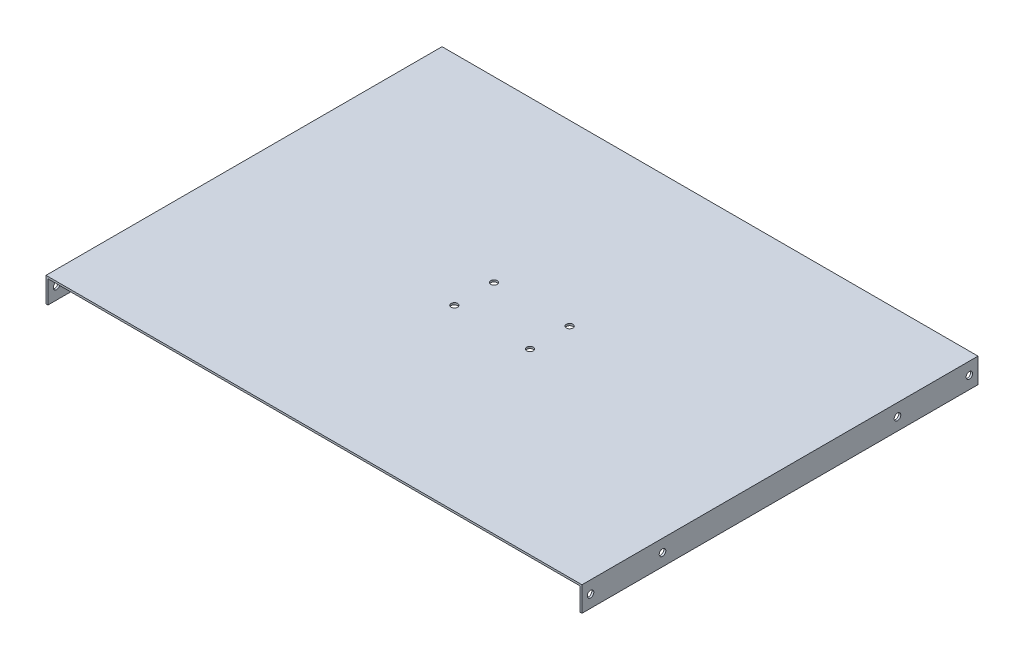
ISO-10303-21;
HEADER;
FILE_DESCRIPTION(('STEP AP214'),'2;1');
FILE_NAME('part.step','',(''),(''),'','','');
FILE_SCHEMA(('AUTOMOTIVE_DESIGN { 1 0 10303 214 1 1 1 1 }'));
ENDSEC;
DATA;
#1=APPLICATION_CONTEXT('core data for automotive mechanical design processes');
#2=APPLICATION_PROTOCOL_DEFINITION('international standard','automotive_design',2000,#1);
#3=PRODUCT_CONTEXT('',#1,'mechanical');
#4=PRODUCT('Part','Part','',(#3));
#5=PRODUCT_RELATED_PRODUCT_CATEGORY('part','',(#4));
#6=PRODUCT_DEFINITION_FORMATION('','',#4);
#7=PRODUCT_DEFINITION_CONTEXT('part definition',#1,'design');
#8=PRODUCT_DEFINITION('design','',#6,#7);
#9=PRODUCT_DEFINITION_SHAPE('','',#8);
#10=(LENGTH_UNIT() NAMED_UNIT(*) SI_UNIT(.MILLI.,.METRE.));
#11=(NAMED_UNIT(*) PLANE_ANGLE_UNIT() SI_UNIT($,.RADIAN.));
#12=(NAMED_UNIT(*) SI_UNIT($,.STERADIAN.) SOLID_ANGLE_UNIT());
#13=UNCERTAINTY_MEASURE_WITH_UNIT(LENGTH_MEASURE(1.E-05),#10,'distance_accuracy_value','');
#14=(GEOMETRIC_REPRESENTATION_CONTEXT(3) GLOBAL_UNCERTAINTY_ASSIGNED_CONTEXT((#13)) GLOBAL_UNIT_ASSIGNED_CONTEXT((#10,
#11,#12)) REPRESENTATION_CONTEXT('',''));
#15=CARTESIAN_POINT('',(0.,0.,0.));
#16=DIRECTION('',(0.,0.,1.));
#17=DIRECTION('',(1.,0.,0.));
#18=AXIS2_PLACEMENT_3D('',#15,#16,#17);
#19=CARTESIAN_POINT('',(0.,15.,0.));
#20=DIRECTION('',(0.,-1.,0.));
#21=DIRECTION('',(0.,0.,-1.));
#22=AXIS2_PLACEMENT_3D('',#19,#20,#21);
#23=PLANE('',#22);
#24=CARTESIAN_POINT('',(22.92,15.,12.));
#25=DIRECTION('',(0.,-1.,0.));
#26=DIRECTION('',(0.,0.,-1.));
#27=AXIS2_PLACEMENT_3D('',#24,#25,#26);
#28=CIRCLE('',#27,2.);
#29=CARTESIAN_POINT('',(22.92,15.,10.));
#30=VERTEX_POINT('',#29);
#31=EDGE_CURVE('E196',#30,#30,#28,.T.);
#32=ORIENTED_EDGE('',*,*,#31,.T.);
#33=EDGE_LOOP('',(#32));
#34=FACE_BOUND('',#33,.T.);
#35=CARTESIAN_POINT('',(-22.92,15.,-12.));
#36=DIRECTION('',(0.,-1.,0.));
#37=DIRECTION('',(0.,0.,-1.));
#38=AXIS2_PLACEMENT_3D('',#35,#36,#37);
#39=CIRCLE('',#38,2.);
#40=CARTESIAN_POINT('',(-22.92,15.,-14.));
#41=VERTEX_POINT('',#40);
#42=EDGE_CURVE('E185',#41,#41,#39,.T.);
#43=ORIENTED_EDGE('',*,*,#42,.T.);
#44=EDGE_LOOP('',(#43));
#45=FACE_BOUND('',#44,.T.);
#46=DIRECTION('',(0.,0.,-1.));
#47=VECTOR('',#46,1.);
#48=CARTESIAN_POINT('',(162.4,15.,120.));
#49=LINE('',#48,#47);
#50=CARTESIAN_POINT('',(162.4,15.,120.));
#51=VERTEX_POINT('',#50);
#52=CARTESIAN_POINT('',(162.4,15.,-120.));
#53=VERTEX_POINT('',#52);
#54=EDGE_CURVE('E152',#51,#53,#49,.T.);
#55=ORIENTED_EDGE('',*,*,#54,.T.);
#56=DIRECTION('',(-1.,0.,0.));
#57=VECTOR('',#56,1.);
#58=CARTESIAN_POINT('',(-162.4,15.,-120.));
#59=LINE('',#58,#57);
#60=CARTESIAN_POINT('',(-162.4,15.,-120.));
#61=VERTEX_POINT('',#60);
#62=EDGE_CURVE('E94',#53,#61,#59,.T.);
#63=ORIENTED_EDGE('',*,*,#62,.T.);
#64=DIRECTION('',(0.,0.,1.));
#65=VECTOR('',#64,1.);
#66=CARTESIAN_POINT('',(-162.4,15.,120.));
#67=LINE('',#66,#65);
#68=CARTESIAN_POINT('',(-162.4,15.,120.));
#69=VERTEX_POINT('',#68);
#70=EDGE_CURVE('E158',#61,#69,#67,.T.);
#71=ORIENTED_EDGE('',*,*,#70,.T.);
#72=DIRECTION('',(1.,0.,0.));
#73=VECTOR('',#72,1.);
#74=CARTESIAN_POINT('',(-162.4,15.,120.));
#75=LINE('',#74,#73);
#76=EDGE_CURVE('E66',#69,#51,#75,.T.);
#77=ORIENTED_EDGE('',*,*,#76,.T.);
#78=EDGE_LOOP('',(#55,#63,#71,#77));
#79=FACE_BOUND('',#78,.T.);
#80=CARTESIAN_POINT('',(22.92,15.,-12.));
#81=DIRECTION('',(0.,-1.,0.));
#82=DIRECTION('',(0.,0.,-1.));
#83=AXIS2_PLACEMENT_3D('',#80,#81,#82);
#84=CIRCLE('',#83,2.);
#85=CARTESIAN_POINT('',(22.92,15.,-14.));
#86=VERTEX_POINT('',#85);
#87=EDGE_CURVE('E191',#86,#86,#84,.F.);
#88=ORIENTED_EDGE('',*,*,#87,.F.);
#89=EDGE_LOOP('',(#88));
#90=FACE_BOUND('',#89,.T.);
#91=CARTESIAN_POINT('',(-22.92,15.,12.));
#92=DIRECTION('',(0.,-1.,0.));
#93=DIRECTION('',(0.,0.,-1.));
#94=AXIS2_PLACEMENT_3D('',#91,#92,#93);
#95=CIRCLE('',#94,2.);
#96=CARTESIAN_POINT('',(-22.92,15.,10.));
#97=VERTEX_POINT('',#96);
#98=EDGE_CURVE('E201',#97,#97,#95,.F.);
#99=ORIENTED_EDGE('',*,*,#98,.F.);
#100=EDGE_LOOP('',(#99));
#101=FACE_BOUND('',#100,.T.);
#102=ADVANCED_FACE('F39',(#34,#45,#79,#90,#101),#23,.F.);
#103=CARTESIAN_POINT('',(0.,13.8,0.));
#104=DIRECTION('',(0.,-1.,0.));
#105=DIRECTION('',(0.,0.,-1.));
#106=AXIS2_PLACEMENT_3D('',#103,#104,#105);
#107=PLANE('',#106);
#108=CARTESIAN_POINT('',(22.92,13.8,-12.));
#109=DIRECTION('',(0.,-1.,0.));
#110=DIRECTION('',(0.,0.,-1.));
#111=AXIS2_PLACEMENT_3D('',#108,#109,#110);
#112=CIRCLE('',#111,2.);
#113=CARTESIAN_POINT('',(22.92,13.8,-14.));
#114=VERTEX_POINT('',#113);
#115=EDGE_CURVE('E187',#114,#114,#112,.F.);
#116=ORIENTED_EDGE('',*,*,#115,.T.);
#117=EDGE_LOOP('',(#116));
#118=FACE_BOUND('',#117,.T.);
#119=CARTESIAN_POINT('',(-22.92,13.8,-12.));
#120=DIRECTION('',(0.,-1.,0.));
#121=DIRECTION('',(0.,0.,-1.));
#122=AXIS2_PLACEMENT_3D('',#119,#120,#121);
#123=CIRCLE('',#122,2.);
#124=CARTESIAN_POINT('',(-22.92,13.8,-14.));
#125=VERTEX_POINT('',#124);
#126=EDGE_CURVE('E181',#125,#125,#123,.T.);
#127=ORIENTED_EDGE('',*,*,#126,.F.);
#128=EDGE_LOOP('',(#127));
#129=FACE_BOUND('',#128,.T.);
#130=DIRECTION('',(0.,0.,-1.));
#131=VECTOR('',#130,1.);
#132=CARTESIAN_POINT('',(161.2,13.8,120.));
#133=LINE('',#132,#131);
#134=CARTESIAN_POINT('',(161.2,13.8,120.));
#135=VERTEX_POINT('',#134);
#136=CARTESIAN_POINT('',(161.2,13.8,-120.));
#137=VERTEX_POINT('',#136);
#138=EDGE_CURVE('E122',#135,#137,#133,.T.);
#139=ORIENTED_EDGE('',*,*,#138,.F.);
#140=DIRECTION('',(1.,0.,0.));
#141=VECTOR('',#140,1.);
#142=CARTESIAN_POINT('',(-161.2,13.8,120.));
#143=LINE('',#142,#141);
#144=CARTESIAN_POINT('',(-161.2,13.8,120.));
#145=VERTEX_POINT('',#144);
#146=EDGE_CURVE('E267',#145,#135,#143,.T.);
#147=ORIENTED_EDGE('',*,*,#146,.F.);
#148=DIRECTION('',(0.,0.,1.));
#149=VECTOR('',#148,1.);
#150=CARTESIAN_POINT('',(-161.2,13.8,120.));
#151=LINE('',#150,#149);
#152=CARTESIAN_POINT('',(-161.2,13.8,-120.));
#153=VERTEX_POINT('',#152);
#154=EDGE_CURVE('E124',#153,#145,#151,.T.);
#155=ORIENTED_EDGE('',*,*,#154,.F.);
#156=DIRECTION('',(-1.,0.,0.));
#157=VECTOR('',#156,1.);
#158=CARTESIAN_POINT('',(-161.2,13.8,-120.));
#159=LINE('',#158,#157);
#160=EDGE_CURVE('E117',#137,#153,#159,.T.);
#161=ORIENTED_EDGE('',*,*,#160,.F.);
#162=EDGE_LOOP('',(#139,#147,#155,#161));
#163=FACE_BOUND('',#162,.T.);
#164=CARTESIAN_POINT('',(22.92,13.8,12.));
#165=DIRECTION('',(0.,-1.,0.));
#166=DIRECTION('',(0.,0.,-1.));
#167=AXIS2_PLACEMENT_3D('',#164,#165,#166);
#168=CIRCLE('',#167,2.);
#169=CARTESIAN_POINT('',(22.92,13.8,10.));
#170=VERTEX_POINT('',#169);
#171=EDGE_CURVE('E192',#170,#170,#168,.T.);
#172=ORIENTED_EDGE('',*,*,#171,.F.);
#173=EDGE_LOOP('',(#172));
#174=FACE_BOUND('',#173,.T.);
#175=CARTESIAN_POINT('',(-22.92,13.8,12.));
#176=DIRECTION('',(0.,-1.,0.));
#177=DIRECTION('',(0.,0.,-1.));
#178=AXIS2_PLACEMENT_3D('',#175,#176,#177);
#179=CIRCLE('',#178,2.);
#180=CARTESIAN_POINT('',(-22.92,13.8,10.));
#181=VERTEX_POINT('',#180);
#182=EDGE_CURVE('E197',#181,#181,#179,.F.);
#183=ORIENTED_EDGE('',*,*,#182,.T.);
#184=EDGE_LOOP('',(#183));
#185=FACE_BOUND('',#184,.T.);
#186=ADVANCED_FACE('F119',(#118,#129,#163,#174,#185),#107,.T.);
#187=CARTESIAN_POINT('',(-162.4,15.,-120.));
#188=DIRECTION('',(0.,0.,1.));
#189=DIRECTION('',(1.,0.,0.));
#190=AXIS2_PLACEMENT_3D('',#187,#188,#189);
#191=PLANE('',#190);
#192=DIRECTION('',(0.,-1.,0.));
#193=VECTOR('',#192,1.);
#194=CARTESIAN_POINT('',(161.2,13.8,-120.));
#195=LINE('',#194,#193);
#196=CARTESIAN_POINT('',(161.2,0.,-120.));
#197=VERTEX_POINT('',#196);
#198=EDGE_CURVE('E131',#137,#197,#195,.T.);
#199=ORIENTED_EDGE('',*,*,#198,.F.);
#200=ORIENTED_EDGE('',*,*,#160,.T.);
#201=DIRECTION('',(0.,-1.,0.));
#202=VECTOR('',#201,1.);
#203=CARTESIAN_POINT('',(-161.2,13.8,-120.));
#204=LINE('',#203,#202);
#205=CARTESIAN_POINT('',(-161.2,0.,-120.));
#206=VERTEX_POINT('',#205);
#207=EDGE_CURVE('E142',#153,#206,#204,.T.);
#208=ORIENTED_EDGE('',*,*,#207,.T.);
#209=DIRECTION('',(-1.,0.,0.));
#210=VECTOR('',#209,1.);
#211=CARTESIAN_POINT('',(-162.4,0.,-120.));
#212=LINE('',#211,#210);
#213=CARTESIAN_POINT('',(-162.4,0.,-120.));
#214=VERTEX_POINT('',#213);
#215=EDGE_CURVE('E147',#206,#214,#212,.T.);
#216=ORIENTED_EDGE('',*,*,#215,.T.);
#217=DIRECTION('',(0.,-1.,0.));
#218=VECTOR('',#217,1.);
#219=CARTESIAN_POINT('',(-162.4,15.,-120.));
#220=LINE('',#219,#218);
#221=EDGE_CURVE('E49',#61,#214,#220,.T.);
#222=ORIENTED_EDGE('',*,*,#221,.F.);
#223=ORIENTED_EDGE('',*,*,#62,.F.);
#224=DIRECTION('',(0.,-1.,0.));
#225=VECTOR('',#224,1.);
#226=CARTESIAN_POINT('',(162.4,15.,-120.));
#227=LINE('',#226,#225);
#228=CARTESIAN_POINT('',(162.4,0.,-120.));
#229=VERTEX_POINT('',#228);
#230=EDGE_CURVE('E11',#53,#229,#227,.T.);
#231=ORIENTED_EDGE('',*,*,#230,.T.);
#232=EDGE_CURVE('E139',#229,#197,#212,.T.);
#233=ORIENTED_EDGE('',*,*,#232,.T.);
#234=EDGE_LOOP('',(#199,#200,#208,#216,#222,#223,#231,#233));
#235=FACE_BOUND('',#234,.T.);
#236=ADVANCED_FACE('F138',(#235),#191,.F.);
#237=CARTESIAN_POINT('',(-162.4,15.,120.));
#238=DIRECTION('',(0.,0.,-1.));
#239=DIRECTION('',(-1.,0.,0.));
#240=AXIS2_PLACEMENT_3D('',#237,#238,#239);
#241=PLANE('',#240);
#242=DIRECTION('',(0.,-1.,0.));
#243=VECTOR('',#242,1.);
#244=CARTESIAN_POINT('',(161.2,13.8,120.));
#245=LINE('',#244,#243);
#246=CARTESIAN_POINT('',(161.2,0.,120.));
#247=VERTEX_POINT('',#246);
#248=EDGE_CURVE('E133',#135,#247,#245,.T.);
#249=ORIENTED_EDGE('',*,*,#248,.T.);
#250=DIRECTION('',(1.,0.,0.));
#251=VECTOR('',#250,1.);
#252=CARTESIAN_POINT('',(-162.4,0.,120.));
#253=LINE('',#252,#251);
#254=CARTESIAN_POINT('',(162.4,0.,120.));
#255=VERTEX_POINT('',#254);
#256=EDGE_CURVE('E87',#247,#255,#253,.T.);
#257=ORIENTED_EDGE('',*,*,#256,.T.);
#258=DIRECTION('',(0.,-1.,0.));
#259=VECTOR('',#258,1.);
#260=CARTESIAN_POINT('',(162.4,15.,120.));
#261=LINE('',#260,#259);
#262=EDGE_CURVE('E162',#51,#255,#261,.T.);
#263=ORIENTED_EDGE('',*,*,#262,.F.);
#264=ORIENTED_EDGE('',*,*,#76,.F.);
#265=DIRECTION('',(0.,-1.,0.));
#266=VECTOR('',#265,1.);
#267=CARTESIAN_POINT('',(-162.4,15.,120.));
#268=LINE('',#267,#266);
#269=CARTESIAN_POINT('',(-162.4,0.,120.));
#270=VERTEX_POINT('',#269);
#271=EDGE_CURVE('E174',#69,#270,#268,.T.);
#272=ORIENTED_EDGE('',*,*,#271,.T.);
#273=CARTESIAN_POINT('',(-161.2,0.,120.));
#274=VERTEX_POINT('',#273);
#275=EDGE_CURVE('E155',#270,#274,#253,.T.);
#276=ORIENTED_EDGE('',*,*,#275,.T.);
#277=DIRECTION('',(0.,-1.,0.));
#278=VECTOR('',#277,1.);
#279=CARTESIAN_POINT('',(-161.2,13.8,120.));
#280=LINE('',#279,#278);
#281=EDGE_CURVE('E57',#145,#274,#280,.T.);
#282=ORIENTED_EDGE('',*,*,#281,.F.);
#283=ORIENTED_EDGE('',*,*,#146,.T.);
#284=EDGE_LOOP('',(#249,#257,#263,#264,#272,#276,#282,#283));
#285=FACE_BOUND('',#284,.T.);
#286=ADVANCED_FACE('F309',(#285),#241,.F.);
#287=CARTESIAN_POINT('',(0.,0.,0.));
#288=DIRECTION('',(0.,-1.,0.));
#289=DIRECTION('',(0.,0.,-1.));
#290=AXIS2_PLACEMENT_3D('',#287,#288,#289);
#291=PLANE('',#290);
#292=ORIENTED_EDGE('',*,*,#256,.F.);
#293=DIRECTION('',(0.,0.,-1.));
#294=VECTOR('',#293,1.);
#295=CARTESIAN_POINT('',(161.2,0.,120.));
#296=LINE('',#295,#294);
#297=EDGE_CURVE('E263',#247,#197,#296,.T.);
#298=ORIENTED_EDGE('',*,*,#297,.T.);
#299=ORIENTED_EDGE('',*,*,#232,.F.);
#300=DIRECTION('',(0.,0.,-1.));
#301=VECTOR('',#300,1.);
#302=CARTESIAN_POINT('',(162.4,0.,120.));
#303=LINE('',#302,#301);
#304=EDGE_CURVE('E141',#255,#229,#303,.T.);
#305=ORIENTED_EDGE('',*,*,#304,.F.);
#306=EDGE_LOOP('',(#292,#298,#299,#305));
#307=FACE_BOUND('',#306,.T.);
#308=ADVANCED_FACE('F319',(#307),#291,.T.);
#309=ORIENTED_EDGE('',*,*,#215,.F.);
#310=DIRECTION('',(0.,0.,1.));
#311=VECTOR('',#310,1.);
#312=CARTESIAN_POINT('',(-161.2,0.,120.));
#313=LINE('',#312,#311);
#314=EDGE_CURVE('E135',#206,#274,#313,.T.);
#315=ORIENTED_EDGE('',*,*,#314,.T.);
#316=ORIENTED_EDGE('',*,*,#275,.F.);
#317=DIRECTION('',(0.,0.,1.));
#318=VECTOR('',#317,1.);
#319=CARTESIAN_POINT('',(-162.4,0.,120.));
#320=LINE('',#319,#318);
#321=EDGE_CURVE('E166',#214,#270,#320,.T.);
#322=ORIENTED_EDGE('',*,*,#321,.F.);
#323=EDGE_LOOP('',(#309,#315,#316,#322));
#324=FACE_BOUND('',#323,.T.);
#325=ADVANCED_FACE('F310',(#324),#291,.T.);
#326=CARTESIAN_POINT('',(162.4,15.,120.));
#327=DIRECTION('',(-1.,0.,0.));
#328=DIRECTION('',(0.,0.,1.));
#329=AXIS2_PLACEMENT_3D('',#326,#327,#328);
#330=PLANE('',#329);
#331=CARTESIAN_POINT('',(162.4,7.5,-114.8));
#332=DIRECTION('',(-1.,0.,0.));
#333=DIRECTION('',(0.,0.,1.));
#334=AXIS2_PLACEMENT_3D('',#331,#332,#333);
#335=CIRCLE('',#334,2.);
#336=CARTESIAN_POINT('',(162.4,7.5,-112.8));
#337=VERTEX_POINT('',#336);
#338=EDGE_CURVE('E186',#337,#337,#335,.F.);
#339=ORIENTED_EDGE('',*,*,#338,.F.);
#340=EDGE_LOOP('',(#339));
#341=FACE_BOUND('',#340,.T.);
#342=CARTESIAN_POINT('',(162.4,7.5,71.2));
#343=DIRECTION('',(-1.,0.,0.));
#344=DIRECTION('',(0.,0.,1.));
#345=AXIS2_PLACEMENT_3D('',#342,#343,#344);
#346=CIRCLE('',#345,2.);
#347=CARTESIAN_POINT('',(162.4,7.5,73.2));
#348=VERTEX_POINT('',#347);
#349=EDGE_CURVE('E237',#348,#348,#346,.F.);
#350=ORIENTED_EDGE('',*,*,#349,.F.);
#351=EDGE_LOOP('',(#350));
#352=FACE_BOUND('',#351,.T.);
#353=CARTESIAN_POINT('',(162.4,7.5,114.8));
#354=DIRECTION('',(-1.,0.,0.));
#355=DIRECTION('',(0.,0.,1.));
#356=AXIS2_PLACEMENT_3D('',#353,#354,#355);
#357=CIRCLE('',#356,2.);
#358=CARTESIAN_POINT('',(162.4,7.5,116.8));
#359=VERTEX_POINT('',#358);
#360=EDGE_CURVE('E216',#359,#359,#357,.F.);
#361=ORIENTED_EDGE('',*,*,#360,.F.);
#362=EDGE_LOOP('',(#361));
#363=FACE_BOUND('',#362,.T.);
#364=CARTESIAN_POINT('',(162.4,7.5,-71.2));
#365=DIRECTION('',(-1.,0.,0.));
#366=DIRECTION('',(0.,0.,1.));
#367=AXIS2_PLACEMENT_3D('',#364,#365,#366);
#368=CIRCLE('',#367,2.);
#369=CARTESIAN_POINT('',(162.4,7.5,-69.2));
#370=VERTEX_POINT('',#369);
#371=EDGE_CURVE('E211',#370,#370,#368,.F.);
#372=ORIENTED_EDGE('',*,*,#371,.F.);
#373=EDGE_LOOP('',(#372));
#374=FACE_BOUND('',#373,.T.);
#375=ORIENTED_EDGE('',*,*,#304,.T.);
#376=ORIENTED_EDGE('',*,*,#230,.F.);
#377=ORIENTED_EDGE('',*,*,#54,.F.);
#378=ORIENTED_EDGE('',*,*,#262,.T.);
#379=EDGE_LOOP('',(#375,#376,#377,#378));
#380=FACE_BOUND('',#379,.T.);
#381=ADVANCED_FACE('F41',(#341,#352,#363,#374,#380),#330,.F.);
#382=CARTESIAN_POINT('',(-162.4,15.,120.));
#383=DIRECTION('',(1.,0.,0.));
#384=DIRECTION('',(0.,0.,-1.));
#385=AXIS2_PLACEMENT_3D('',#382,#383,#384);
#386=PLANE('',#385);
#387=CARTESIAN_POINT('',(-162.4,7.5,-114.8));
#388=DIRECTION('',(1.,0.,0.));
#389=DIRECTION('',(0.,0.,-1.));
#390=AXIS2_PLACEMENT_3D('',#387,#388,#389);
#391=CIRCLE('',#390,2.);
#392=CARTESIAN_POINT('',(-162.4,7.5,-116.8));
#393=VERTEX_POINT('',#392);
#394=EDGE_CURVE('E245',#393,#393,#391,.F.);
#395=ORIENTED_EDGE('',*,*,#394,.F.);
#396=EDGE_LOOP('',(#395));
#397=FACE_BOUND('',#396,.T.);
#398=CARTESIAN_POINT('',(-162.4,7.5,71.2));
#399=DIRECTION('',(1.,0.,0.));
#400=DIRECTION('',(0.,0.,-1.));
#401=AXIS2_PLACEMENT_3D('',#398,#399,#400);
#402=CIRCLE('',#401,2.);
#403=CARTESIAN_POINT('',(-162.4,7.5,69.2));
#404=VERTEX_POINT('',#403);
#405=EDGE_CURVE('E222',#404,#404,#402,.F.);
#406=ORIENTED_EDGE('',*,*,#405,.F.);
#407=EDGE_LOOP('',(#406));
#408=FACE_BOUND('',#407,.T.);
#409=CARTESIAN_POINT('',(-162.4,7.5,114.8));
#410=DIRECTION('',(1.,0.,0.));
#411=DIRECTION('',(0.,0.,-1.));
#412=AXIS2_PLACEMENT_3D('',#409,#410,#411);
#413=CIRCLE('',#412,2.);
#414=CARTESIAN_POINT('',(-162.4,7.5,112.8));
#415=VERTEX_POINT('',#414);
#416=EDGE_CURVE('E225',#415,#415,#413,.F.);
#417=ORIENTED_EDGE('',*,*,#416,.F.);
#418=EDGE_LOOP('',(#417));
#419=FACE_BOUND('',#418,.T.);
#420=CARTESIAN_POINT('',(-162.4,7.5,-71.2));
#421=DIRECTION('',(1.,0.,0.));
#422=DIRECTION('',(0.,0.,-1.));
#423=AXIS2_PLACEMENT_3D('',#420,#421,#422);
#424=CIRCLE('',#423,2.);
#425=CARTESIAN_POINT('',(-162.4,7.5,-73.2));
#426=VERTEX_POINT('',#425);
#427=EDGE_CURVE('E302',#426,#426,#424,.F.);
#428=ORIENTED_EDGE('',*,*,#427,.F.);
#429=EDGE_LOOP('',(#428));
#430=FACE_BOUND('',#429,.T.);
#431=ORIENTED_EDGE('',*,*,#321,.T.);
#432=ORIENTED_EDGE('',*,*,#271,.F.);
#433=ORIENTED_EDGE('',*,*,#70,.F.);
#434=ORIENTED_EDGE('',*,*,#221,.T.);
#435=EDGE_LOOP('',(#431,#432,#433,#434));
#436=FACE_BOUND('',#435,.T.);
#437=ADVANCED_FACE('F291',(#397,#408,#419,#430,#436),#386,.F.);
#438=CARTESIAN_POINT('',(161.2,13.8,120.));
#439=DIRECTION('',(-1.,0.,0.));
#440=DIRECTION('',(0.,0.,1.));
#441=AXIS2_PLACEMENT_3D('',#438,#439,#440);
#442=PLANE('',#441);
#443=CARTESIAN_POINT('',(161.2,7.5,-114.8));
#444=DIRECTION('',(-1.,0.,0.));
#445=DIRECTION('',(0.,0.,1.));
#446=AXIS2_PLACEMENT_3D('',#443,#444,#445);
#447=CIRCLE('',#446,2.);
#448=CARTESIAN_POINT('',(161.2,7.5,-112.8));
#449=VERTEX_POINT('',#448);
#450=EDGE_CURVE('E241',#449,#449,#447,.F.);
#451=ORIENTED_EDGE('',*,*,#450,.T.);
#452=EDGE_LOOP('',(#451));
#453=FACE_BOUND('',#452,.T.);
#454=CARTESIAN_POINT('',(161.2,7.5,71.2));
#455=DIRECTION('',(-1.,0.,0.));
#456=DIRECTION('',(0.,0.,1.));
#457=AXIS2_PLACEMENT_3D('',#454,#455,#456);
#458=CIRCLE('',#457,2.);
#459=CARTESIAN_POINT('',(161.2,7.5,73.2));
#460=VERTEX_POINT('',#459);
#461=EDGE_CURVE('E215',#460,#460,#458,.F.);
#462=ORIENTED_EDGE('',*,*,#461,.T.);
#463=EDGE_LOOP('',(#462));
#464=FACE_BOUND('',#463,.T.);
#465=CARTESIAN_POINT('',(161.2,7.5,114.8));
#466=DIRECTION('',(-1.,0.,0.));
#467=DIRECTION('',(0.,0.,1.));
#468=AXIS2_PLACEMENT_3D('',#465,#466,#467);
#469=CIRCLE('',#468,2.);
#470=CARTESIAN_POINT('',(161.2,7.5,116.8));
#471=VERTEX_POINT('',#470);
#472=EDGE_CURVE('E210',#471,#471,#469,.F.);
#473=ORIENTED_EDGE('',*,*,#472,.T.);
#474=EDGE_LOOP('',(#473));
#475=FACE_BOUND('',#474,.T.);
#476=CARTESIAN_POINT('',(161.2,7.5,-71.2));
#477=DIRECTION('',(-1.,0.,0.));
#478=DIRECTION('',(0.,0.,1.));
#479=AXIS2_PLACEMENT_3D('',#476,#477,#478);
#480=CIRCLE('',#479,2.);
#481=CARTESIAN_POINT('',(161.2,7.5,-69.2));
#482=VERTEX_POINT('',#481);
#483=EDGE_CURVE('E206',#482,#482,#480,.F.);
#484=ORIENTED_EDGE('',*,*,#483,.T.);
#485=EDGE_LOOP('',(#484));
#486=FACE_BOUND('',#485,.T.);
#487=ORIENTED_EDGE('',*,*,#297,.F.);
#488=ORIENTED_EDGE('',*,*,#248,.F.);
#489=ORIENTED_EDGE('',*,*,#138,.T.);
#490=ORIENTED_EDGE('',*,*,#198,.T.);
#491=EDGE_LOOP('',(#487,#488,#489,#490));
#492=FACE_BOUND('',#491,.T.);
#493=ADVANCED_FACE('F130',(#453,#464,#475,#486,#492),#442,.T.);
#494=CARTESIAN_POINT('',(-161.2,13.8,120.));
#495=DIRECTION('',(1.,0.,0.));
#496=DIRECTION('',(0.,0.,-1.));
#497=AXIS2_PLACEMENT_3D('',#494,#495,#496);
#498=PLANE('',#497);
#499=CARTESIAN_POINT('',(-161.2,7.5,-114.8));
#500=DIRECTION('',(1.,0.,0.));
#501=DIRECTION('',(0.,0.,-1.));
#502=AXIS2_PLACEMENT_3D('',#499,#500,#501);
#503=CIRCLE('',#502,2.);
#504=CARTESIAN_POINT('',(-161.2,7.5,-116.8));
#505=VERTEX_POINT('',#504);
#506=EDGE_CURVE('E43',#505,#505,#503,.F.);
#507=ORIENTED_EDGE('',*,*,#506,.T.);
#508=EDGE_LOOP('',(#507));
#509=FACE_BOUND('',#508,.T.);
#510=CARTESIAN_POINT('',(-161.2,7.5,71.2));
#511=DIRECTION('',(1.,0.,0.));
#512=DIRECTION('',(0.,0.,-1.));
#513=AXIS2_PLACEMENT_3D('',#510,#511,#512);
#514=CIRCLE('',#513,2.);
#515=CARTESIAN_POINT('',(-161.2,7.5,69.2));
#516=VERTEX_POINT('',#515);
#517=EDGE_CURVE('E212',#516,#516,#514,.F.);
#518=ORIENTED_EDGE('',*,*,#517,.T.);
#519=EDGE_LOOP('',(#518));
#520=FACE_BOUND('',#519,.T.);
#521=CARTESIAN_POINT('',(-161.2,7.5,114.8));
#522=DIRECTION('',(1.,0.,0.));
#523=DIRECTION('',(0.,0.,-1.));
#524=AXIS2_PLACEMENT_3D('',#521,#522,#523);
#525=CIRCLE('',#524,2.);
#526=CARTESIAN_POINT('',(-161.2,7.5,112.8));
#527=VERTEX_POINT('',#526);
#528=EDGE_CURVE('E207',#527,#527,#525,.F.);
#529=ORIENTED_EDGE('',*,*,#528,.T.);
#530=EDGE_LOOP('',(#529));
#531=FACE_BOUND('',#530,.T.);
#532=CARTESIAN_POINT('',(-161.2,7.5,-71.2));
#533=DIRECTION('',(1.,0.,0.));
#534=DIRECTION('',(0.,0.,-1.));
#535=AXIS2_PLACEMENT_3D('',#532,#533,#534);
#536=CIRCLE('',#535,2.);
#537=CARTESIAN_POINT('',(-161.2,7.5,-73.2));
#538=VERTEX_POINT('',#537);
#539=EDGE_CURVE('E202',#538,#538,#536,.F.);
#540=ORIENTED_EDGE('',*,*,#539,.T.);
#541=EDGE_LOOP('',(#540));
#542=FACE_BOUND('',#541,.T.);
#543=ORIENTED_EDGE('',*,*,#314,.F.);
#544=ORIENTED_EDGE('',*,*,#207,.F.);
#545=ORIENTED_EDGE('',*,*,#154,.T.);
#546=ORIENTED_EDGE('',*,*,#281,.T.);
#547=EDGE_LOOP('',(#543,#544,#545,#546));
#548=FACE_BOUND('',#547,.T.);
#549=ADVANCED_FACE('F280',(#509,#520,#531,#542,#548),#498,.T.);
#550=CARTESIAN_POINT('',(-22.92,23.8,-12.));
#551=DIRECTION('',(0.,-1.,0.));
#552=DIRECTION('',(0.,0.,-1.));
#553=AXIS2_PLACEMENT_3D('',#550,#551,#552);
#554=CYLINDRICAL_SURFACE('',#553,2.);
#555=CARTESIAN_POINT('',(-22.92,13.8,-14.));
#556=CARTESIAN_POINT('',(-22.92,13.8125,-14.));
#557=CARTESIAN_POINT('',(-22.92,13.825,-14.));
#558=CARTESIAN_POINT('',(-22.92,13.85,-14.));
#559=CARTESIAN_POINT('',(-22.92,13.8625,-14.));
#560=CARTESIAN_POINT('',(-22.92,13.8875,-14.));
#561=CARTESIAN_POINT('',(-22.92,13.9,-14.));
#562=CARTESIAN_POINT('',(-22.92,13.925,-14.));
#563=CARTESIAN_POINT('',(-22.92,13.9375,-14.));
#564=CARTESIAN_POINT('',(-22.92,13.9625,-14.));
#565=CARTESIAN_POINT('',(-22.92,13.975,-14.));
#566=CARTESIAN_POINT('',(-22.92,14.,-14.));
#567=CARTESIAN_POINT('',(-22.92,14.0125,-14.));
#568=CARTESIAN_POINT('',(-22.92,14.0375,-14.));
#569=CARTESIAN_POINT('',(-22.92,14.05,-14.));
#570=CARTESIAN_POINT('',(-22.92,14.075,-14.));
#571=CARTESIAN_POINT('',(-22.92,14.0875,-14.));
#572=CARTESIAN_POINT('',(-22.92,14.1125,-14.));
#573=CARTESIAN_POINT('',(-22.92,14.125,-14.));
#574=CARTESIAN_POINT('',(-22.92,14.15,-14.));
#575=CARTESIAN_POINT('',(-22.92,14.1625,-14.));
#576=CARTESIAN_POINT('',(-22.92,14.1875,-14.));
#577=CARTESIAN_POINT('',(-22.92,14.2,-14.));
#578=CARTESIAN_POINT('',(-22.92,14.225,-14.));
#579=CARTESIAN_POINT('',(-22.92,14.2375,-14.));
#580=CARTESIAN_POINT('',(-22.92,14.2625,-14.));
#581=CARTESIAN_POINT('',(-22.92,14.275,-14.));
#582=CARTESIAN_POINT('',(-22.92,14.3,-14.));
#583=CARTESIAN_POINT('',(-22.92,14.3125,-14.));
#584=CARTESIAN_POINT('',(-22.92,14.3375,-14.));
#585=CARTESIAN_POINT('',(-22.92,14.35,-14.));
#586=CARTESIAN_POINT('',(-22.92,14.375,-14.));
#587=CARTESIAN_POINT('',(-22.92,14.3875,-14.));
#588=CARTESIAN_POINT('',(-22.92,14.4125,-14.));
#589=CARTESIAN_POINT('',(-22.92,14.425,-14.));
#590=CARTESIAN_POINT('',(-22.92,14.45,-14.));
#591=CARTESIAN_POINT('',(-22.92,14.4625,-14.));
#592=CARTESIAN_POINT('',(-22.92,14.4875,-14.));
#593=CARTESIAN_POINT('',(-22.92,14.5,-14.));
#594=CARTESIAN_POINT('',(-22.92,14.525,-14.));
#595=CARTESIAN_POINT('',(-22.92,14.5375,-14.));
#596=CARTESIAN_POINT('',(-22.92,14.5625,-14.));
#597=CARTESIAN_POINT('',(-22.92,14.575,-14.));
#598=CARTESIAN_POINT('',(-22.92,14.6,-14.));
#599=CARTESIAN_POINT('',(-22.92,14.6125,-14.));
#600=CARTESIAN_POINT('',(-22.92,14.6375,-14.));
#601=CARTESIAN_POINT('',(-22.92,14.65,-14.));
#602=CARTESIAN_POINT('',(-22.92,14.675,-14.));
#603=CARTESIAN_POINT('',(-22.92,14.6875,-14.));
#604=CARTESIAN_POINT('',(-22.92,14.7125,-14.));
#605=CARTESIAN_POINT('',(-22.92,14.725,-14.));
#606=CARTESIAN_POINT('',(-22.92,14.75,-14.));
#607=CARTESIAN_POINT('',(-22.92,14.7625,-14.));
#608=CARTESIAN_POINT('',(-22.92,14.7875,-14.));
#609=CARTESIAN_POINT('',(-22.92,14.8,-14.));
#610=CARTESIAN_POINT('',(-22.92,14.825,-14.));
#611=CARTESIAN_POINT('',(-22.92,14.8375,-14.));
#612=CARTESIAN_POINT('',(-22.92,14.8625,-14.));
#613=CARTESIAN_POINT('',(-22.92,14.875,-14.));
#614=CARTESIAN_POINT('',(-22.92,14.9,-14.));
#615=CARTESIAN_POINT('',(-22.92,14.9125,-14.));
#616=CARTESIAN_POINT('',(-22.92,14.9375,-14.));
#617=CARTESIAN_POINT('',(-22.92,14.95,-14.));
#618=CARTESIAN_POINT('',(-22.92,14.975,-14.));
#619=CARTESIAN_POINT('',(-22.92,14.9875,-14.));
#620=CARTESIAN_POINT('',(-22.92,15.,-14.));
#621=B_SPLINE_CURVE_WITH_KNOTS('',3,(#555,#556,#557,#558,#559,#560,#561,#562,#563,#564,#565,
#566,#567,#568,#569,#570,#571,#572,#573,#574,#575,#576,#577,#578,#579,#580,#581,#582,#583,#584,
#585,#586,#587,#588,#589,#590,#591,#592,#593,#594,#595,#596,#597,#598,#599,#600,#601,#602,#603,
#604,#605,#606,#607,#608,#609,#610,#611,#612,#613,#614,#615,#616,#617,#618,#619,#620),
.UNSPECIFIED.,.F.,.F.,(4,2,2,2,2,2,2,2,2,2,2,2,2,2,2,2,2,2,2,2,2,2,2,2,2,2,2,2,2,2,2,2,4),(0.,
0.0374999999999993,0.0750000000000004,0.1125,0.150000000000001,0.1875,0.225,0.262500000000001,
0.3,0.337499999999999,0.375,0.4125,0.449999999999999,0.4875,0.524999999999999,0.5625,0.6,
0.637499999999999,0.675,0.7125,0.750000000000001,0.7875,0.824999999999999,0.8625,0.9,
0.937499999999999,0.975,1.0125,1.05,1.0875,1.125,1.1625,1.2),.UNSPECIFIED.);
#622=EDGE_CURVE('BSEAM341',#125,#41,#621,.T.);
#623=ORIENTED_EDGE('',*,*,#126,.T.);
#624=ORIENTED_EDGE('',*,*,#42,.F.);
#625=ORIENTED_EDGE('',*,*,#622,.T.);
#626=ORIENTED_EDGE('',*,*,#622,.F.);
#627=EDGE_LOOP('',(#623,#625,#624,#626));
#628=FACE_BOUND('',#627,.T.);
#629=ADVANCED_FACE('F341',(#628),#554,.F.);
#630=CARTESIAN_POINT('',(22.92,23.8,-12.));
#631=DIRECTION('',(0.,-1.,0.));
#632=DIRECTION('',(0.,0.,-1.));
#633=AXIS2_PLACEMENT_3D('',#630,#631,#632);
#634=CYLINDRICAL_SURFACE('',#633,2.);
#635=CARTESIAN_POINT('',(22.92,13.8,-14.));
#636=CARTESIAN_POINT('',(22.92,13.8125,-14.));
#637=CARTESIAN_POINT('',(22.92,13.825,-14.));
#638=CARTESIAN_POINT('',(22.92,13.85,-14.));
#639=CARTESIAN_POINT('',(22.92,13.8625,-14.));
#640=CARTESIAN_POINT('',(22.92,13.8875,-14.));
#641=CARTESIAN_POINT('',(22.92,13.9,-14.));
#642=CARTESIAN_POINT('',(22.92,13.925,-14.));
#643=CARTESIAN_POINT('',(22.92,13.9375,-14.));
#644=CARTESIAN_POINT('',(22.92,13.9625,-14.));
#645=CARTESIAN_POINT('',(22.92,13.975,-14.));
#646=CARTESIAN_POINT('',(22.92,14.,-14.));
#647=CARTESIAN_POINT('',(22.92,14.0125,-14.));
#648=CARTESIAN_POINT('',(22.92,14.0375,-14.));
#649=CARTESIAN_POINT('',(22.92,14.05,-14.));
#650=CARTESIAN_POINT('',(22.92,14.075,-14.));
#651=CARTESIAN_POINT('',(22.92,14.0875,-14.));
#652=CARTESIAN_POINT('',(22.92,14.1125,-14.));
#653=CARTESIAN_POINT('',(22.92,14.125,-14.));
#654=CARTESIAN_POINT('',(22.92,14.15,-14.));
#655=CARTESIAN_POINT('',(22.92,14.1625,-14.));
#656=CARTESIAN_POINT('',(22.92,14.1875,-14.));
#657=CARTESIAN_POINT('',(22.92,14.2,-14.));
#658=CARTESIAN_POINT('',(22.92,14.225,-14.));
#659=CARTESIAN_POINT('',(22.92,14.2375,-14.));
#660=CARTESIAN_POINT('',(22.92,14.2625,-14.));
#661=CARTESIAN_POINT('',(22.92,14.275,-14.));
#662=CARTESIAN_POINT('',(22.92,14.3,-14.));
#663=CARTESIAN_POINT('',(22.92,14.3125,-14.));
#664=CARTESIAN_POINT('',(22.92,14.3375,-14.));
#665=CARTESIAN_POINT('',(22.92,14.35,-14.));
#666=CARTESIAN_POINT('',(22.92,14.375,-14.));
#667=CARTESIAN_POINT('',(22.92,14.3875,-14.));
#668=CARTESIAN_POINT('',(22.92,14.4125,-14.));
#669=CARTESIAN_POINT('',(22.92,14.425,-14.));
#670=CARTESIAN_POINT('',(22.92,14.45,-14.));
#671=CARTESIAN_POINT('',(22.92,14.4625,-14.));
#672=CARTESIAN_POINT('',(22.92,14.4875,-14.));
#673=CARTESIAN_POINT('',(22.92,14.5,-14.));
#674=CARTESIAN_POINT('',(22.92,14.525,-14.));
#675=CARTESIAN_POINT('',(22.92,14.5375,-14.));
#676=CARTESIAN_POINT('',(22.92,14.5625,-14.));
#677=CARTESIAN_POINT('',(22.92,14.575,-14.));
#678=CARTESIAN_POINT('',(22.92,14.6,-14.));
#679=CARTESIAN_POINT('',(22.92,14.6125,-14.));
#680=CARTESIAN_POINT('',(22.92,14.6375,-14.));
#681=CARTESIAN_POINT('',(22.92,14.65,-14.));
#682=CARTESIAN_POINT('',(22.92,14.675,-14.));
#683=CARTESIAN_POINT('',(22.92,14.6875,-14.));
#684=CARTESIAN_POINT('',(22.92,14.7125,-14.));
#685=CARTESIAN_POINT('',(22.92,14.725,-14.));
#686=CARTESIAN_POINT('',(22.92,14.75,-14.));
#687=CARTESIAN_POINT('',(22.92,14.7625,-14.));
#688=CARTESIAN_POINT('',(22.92,14.7875,-14.));
#689=CARTESIAN_POINT('',(22.92,14.8,-14.));
#690=CARTESIAN_POINT('',(22.92,14.825,-14.));
#691=CARTESIAN_POINT('',(22.92,14.8375,-14.));
#692=CARTESIAN_POINT('',(22.92,14.8625,-14.));
#693=CARTESIAN_POINT('',(22.92,14.875,-14.));
#694=CARTESIAN_POINT('',(22.92,14.9,-14.));
#695=CARTESIAN_POINT('',(22.92,14.9125,-14.));
#696=CARTESIAN_POINT('',(22.92,14.9375,-14.));
#697=CARTESIAN_POINT('',(22.92,14.95,-14.));
#698=CARTESIAN_POINT('',(22.92,14.975,-14.));
#699=CARTESIAN_POINT('',(22.92,14.9875,-14.));
#700=CARTESIAN_POINT('',(22.92,15.,-14.));
#701=B_SPLINE_CURVE_WITH_KNOTS('',3,(#635,#636,#637,#638,#639,#640,#641,#642,#643,#644,#645,
#646,#647,#648,#649,#650,#651,#652,#653,#654,#655,#656,#657,#658,#659,#660,#661,#662,#663,#664,
#665,#666,#667,#668,#669,#670,#671,#672,#673,#674,#675,#676,#677,#678,#679,#680,#681,#682,#683,
#684,#685,#686,#687,#688,#689,#690,#691,#692,#693,#694,#695,#696,#697,#698,#699,#700),
.UNSPECIFIED.,.F.,.F.,(4,2,2,2,2,2,2,2,2,2,2,2,2,2,2,2,2,2,2,2,2,2,2,2,2,2,2,2,2,2,2,2,4),(0.,
0.0374999999999993,0.0750000000000004,0.1125,0.150000000000001,0.1875,0.225,0.262500000000001,
0.3,0.337499999999999,0.375,0.4125,0.449999999999999,0.4875,0.524999999999999,0.5625,0.6,
0.637499999999999,0.675,0.7125,0.750000000000001,0.7875,0.824999999999999,0.8625,0.9,
0.937499999999999,0.975,1.0125,1.05,1.0875,1.125,1.1625,1.2),.UNSPECIFIED.);
#702=EDGE_CURVE('BSEAM345',#114,#86,#701,.T.);
#703=ORIENTED_EDGE('',*,*,#115,.F.);
#704=ORIENTED_EDGE('',*,*,#87,.T.);
#705=ORIENTED_EDGE('',*,*,#702,.T.);
#706=ORIENTED_EDGE('',*,*,#702,.F.);
#707=EDGE_LOOP('',(#703,#705,#704,#706));
#708=FACE_BOUND('',#707,.T.);
#709=ADVANCED_FACE('F345',(#708),#634,.F.);
#710=CARTESIAN_POINT('',(22.92,23.8,12.));
#711=DIRECTION('',(0.,-1.,0.));
#712=DIRECTION('',(0.,0.,-1.));
#713=AXIS2_PLACEMENT_3D('',#710,#711,#712);
#714=CYLINDRICAL_SURFACE('',#713,2.);
#715=CARTESIAN_POINT('',(22.92,13.8,10.));
#716=CARTESIAN_POINT('',(22.92,13.8125,10.));
#717=CARTESIAN_POINT('',(22.92,13.825,10.));
#718=CARTESIAN_POINT('',(22.92,13.85,10.));
#719=CARTESIAN_POINT('',(22.92,13.8625,10.));
#720=CARTESIAN_POINT('',(22.92,13.8875,10.));
#721=CARTESIAN_POINT('',(22.92,13.9,10.));
#722=CARTESIAN_POINT('',(22.92,13.925,10.));
#723=CARTESIAN_POINT('',(22.92,13.9375,10.));
#724=CARTESIAN_POINT('',(22.92,13.9625,10.));
#725=CARTESIAN_POINT('',(22.92,13.975,10.));
#726=CARTESIAN_POINT('',(22.92,14.,10.));
#727=CARTESIAN_POINT('',(22.92,14.0125,10.));
#728=CARTESIAN_POINT('',(22.92,14.0375,10.));
#729=CARTESIAN_POINT('',(22.92,14.05,10.));
#730=CARTESIAN_POINT('',(22.92,14.075,10.));
#731=CARTESIAN_POINT('',(22.92,14.0875,10.));
#732=CARTESIAN_POINT('',(22.92,14.1125,10.));
#733=CARTESIAN_POINT('',(22.92,14.125,10.));
#734=CARTESIAN_POINT('',(22.92,14.15,10.));
#735=CARTESIAN_POINT('',(22.92,14.1625,10.));
#736=CARTESIAN_POINT('',(22.92,14.1875,10.));
#737=CARTESIAN_POINT('',(22.92,14.2,10.));
#738=CARTESIAN_POINT('',(22.92,14.225,10.));
#739=CARTESIAN_POINT('',(22.92,14.2375,10.));
#740=CARTESIAN_POINT('',(22.92,14.2625,10.));
#741=CARTESIAN_POINT('',(22.92,14.275,10.));
#742=CARTESIAN_POINT('',(22.92,14.3,10.));
#743=CARTESIAN_POINT('',(22.92,14.3125,10.));
#744=CARTESIAN_POINT('',(22.92,14.3375,10.));
#745=CARTESIAN_POINT('',(22.92,14.35,10.));
#746=CARTESIAN_POINT('',(22.92,14.375,10.));
#747=CARTESIAN_POINT('',(22.92,14.3875,10.));
#748=CARTESIAN_POINT('',(22.92,14.4125,10.));
#749=CARTESIAN_POINT('',(22.92,14.425,10.));
#750=CARTESIAN_POINT('',(22.92,14.45,10.));
#751=CARTESIAN_POINT('',(22.92,14.4625,10.));
#752=CARTESIAN_POINT('',(22.92,14.4875,10.));
#753=CARTESIAN_POINT('',(22.92,14.5,10.));
#754=CARTESIAN_POINT('',(22.92,14.525,10.));
#755=CARTESIAN_POINT('',(22.92,14.5375,10.));
#756=CARTESIAN_POINT('',(22.92,14.5625,10.));
#757=CARTESIAN_POINT('',(22.92,14.575,10.));
#758=CARTESIAN_POINT('',(22.92,14.6,10.));
#759=CARTESIAN_POINT('',(22.92,14.6125,10.));
#760=CARTESIAN_POINT('',(22.92,14.6375,10.));
#761=CARTESIAN_POINT('',(22.92,14.65,10.));
#762=CARTESIAN_POINT('',(22.92,14.675,10.));
#763=CARTESIAN_POINT('',(22.92,14.6875,10.));
#764=CARTESIAN_POINT('',(22.92,14.7125,10.));
#765=CARTESIAN_POINT('',(22.92,14.725,10.));
#766=CARTESIAN_POINT('',(22.92,14.75,10.));
#767=CARTESIAN_POINT('',(22.92,14.7625,10.));
#768=CARTESIAN_POINT('',(22.92,14.7875,10.));
#769=CARTESIAN_POINT('',(22.92,14.8,10.));
#770=CARTESIAN_POINT('',(22.92,14.825,10.));
#771=CARTESIAN_POINT('',(22.92,14.8375,10.));
#772=CARTESIAN_POINT('',(22.92,14.8625,10.));
#773=CARTESIAN_POINT('',(22.92,14.875,10.));
#774=CARTESIAN_POINT('',(22.92,14.9,10.));
#775=CARTESIAN_POINT('',(22.92,14.9125,10.));
#776=CARTESIAN_POINT('',(22.92,14.9375,10.));
#777=CARTESIAN_POINT('',(22.92,14.95,10.));
#778=CARTESIAN_POINT('',(22.92,14.975,10.));
#779=CARTESIAN_POINT('',(22.92,14.9875,10.));
#780=CARTESIAN_POINT('',(22.92,15.,10.));
#781=B_SPLINE_CURVE_WITH_KNOTS('',3,(#715,#716,#717,#718,#719,#720,#721,#722,#723,#724,#725,
#726,#727,#728,#729,#730,#731,#732,#733,#734,#735,#736,#737,#738,#739,#740,#741,#742,#743,#744,
#745,#746,#747,#748,#749,#750,#751,#752,#753,#754,#755,#756,#757,#758,#759,#760,#761,#762,#763,
#764,#765,#766,#767,#768,#769,#770,#771,#772,#773,#774,#775,#776,#777,#778,#779,#780),
.UNSPECIFIED.,.F.,.F.,(4,2,2,2,2,2,2,2,2,2,2,2,2,2,2,2,2,2,2,2,2,2,2,2,2,2,2,2,2,2,2,2,4),(0.,
0.0374999999999993,0.0750000000000004,0.1125,0.150000000000001,0.1875,0.225,0.262500000000001,
0.3,0.337499999999999,0.375,0.4125,0.449999999999999,0.4875,0.524999999999999,0.5625,0.6,
0.637499999999999,0.675,0.7125,0.750000000000001,0.7875,0.824999999999999,0.8625,0.9,
0.937499999999999,0.975,1.0125,1.05,1.0875,1.125,1.1625,1.2),.UNSPECIFIED.);
#782=EDGE_CURVE('BSEAM351',#170,#30,#781,.T.);
#783=ORIENTED_EDGE('',*,*,#171,.T.);
#784=ORIENTED_EDGE('',*,*,#31,.F.);
#785=ORIENTED_EDGE('',*,*,#782,.T.);
#786=ORIENTED_EDGE('',*,*,#782,.F.);
#787=EDGE_LOOP('',(#783,#785,#784,#786));
#788=FACE_BOUND('',#787,.T.);
#789=ADVANCED_FACE('F351',(#788),#714,.F.);
#790=CARTESIAN_POINT('',(-22.92,23.8,12.));
#791=DIRECTION('',(0.,-1.,0.));
#792=DIRECTION('',(0.,0.,-1.));
#793=AXIS2_PLACEMENT_3D('',#790,#791,#792);
#794=CYLINDRICAL_SURFACE('',#793,2.);
#795=CARTESIAN_POINT('',(-22.92,13.8,10.));
#796=CARTESIAN_POINT('',(-22.92,13.8125,10.));
#797=CARTESIAN_POINT('',(-22.92,13.825,10.));
#798=CARTESIAN_POINT('',(-22.92,13.85,10.));
#799=CARTESIAN_POINT('',(-22.92,13.8625,10.));
#800=CARTESIAN_POINT('',(-22.92,13.8875,10.));
#801=CARTESIAN_POINT('',(-22.92,13.9,10.));
#802=CARTESIAN_POINT('',(-22.92,13.925,10.));
#803=CARTESIAN_POINT('',(-22.92,13.9375,10.));
#804=CARTESIAN_POINT('',(-22.92,13.9625,10.));
#805=CARTESIAN_POINT('',(-22.92,13.975,10.));
#806=CARTESIAN_POINT('',(-22.92,14.,10.));
#807=CARTESIAN_POINT('',(-22.92,14.0125,10.));
#808=CARTESIAN_POINT('',(-22.92,14.0375,10.));
#809=CARTESIAN_POINT('',(-22.92,14.05,10.));
#810=CARTESIAN_POINT('',(-22.92,14.075,10.));
#811=CARTESIAN_POINT('',(-22.92,14.0875,10.));
#812=CARTESIAN_POINT('',(-22.92,14.1125,10.));
#813=CARTESIAN_POINT('',(-22.92,14.125,10.));
#814=CARTESIAN_POINT('',(-22.92,14.15,10.));
#815=CARTESIAN_POINT('',(-22.92,14.1625,10.));
#816=CARTESIAN_POINT('',(-22.92,14.1875,10.));
#817=CARTESIAN_POINT('',(-22.92,14.2,10.));
#818=CARTESIAN_POINT('',(-22.92,14.225,10.));
#819=CARTESIAN_POINT('',(-22.92,14.2375,10.));
#820=CARTESIAN_POINT('',(-22.92,14.2625,10.));
#821=CARTESIAN_POINT('',(-22.92,14.275,10.));
#822=CARTESIAN_POINT('',(-22.92,14.3,10.));
#823=CARTESIAN_POINT('',(-22.92,14.3125,10.));
#824=CARTESIAN_POINT('',(-22.92,14.3375,10.));
#825=CARTESIAN_POINT('',(-22.92,14.35,10.));
#826=CARTESIAN_POINT('',(-22.92,14.375,10.));
#827=CARTESIAN_POINT('',(-22.92,14.3875,10.));
#828=CARTESIAN_POINT('',(-22.92,14.4125,10.));
#829=CARTESIAN_POINT('',(-22.92,14.425,10.));
#830=CARTESIAN_POINT('',(-22.92,14.45,10.));
#831=CARTESIAN_POINT('',(-22.92,14.4625,10.));
#832=CARTESIAN_POINT('',(-22.92,14.4875,10.));
#833=CARTESIAN_POINT('',(-22.92,14.5,10.));
#834=CARTESIAN_POINT('',(-22.92,14.525,10.));
#835=CARTESIAN_POINT('',(-22.92,14.5375,10.));
#836=CARTESIAN_POINT('',(-22.92,14.5625,10.));
#837=CARTESIAN_POINT('',(-22.92,14.575,10.));
#838=CARTESIAN_POINT('',(-22.92,14.6,10.));
#839=CARTESIAN_POINT('',(-22.92,14.6125,10.));
#840=CARTESIAN_POINT('',(-22.92,14.6375,10.));
#841=CARTESIAN_POINT('',(-22.92,14.65,10.));
#842=CARTESIAN_POINT('',(-22.92,14.675,10.));
#843=CARTESIAN_POINT('',(-22.92,14.6875,10.));
#844=CARTESIAN_POINT('',(-22.92,14.7125,10.));
#845=CARTESIAN_POINT('',(-22.92,14.725,10.));
#846=CARTESIAN_POINT('',(-22.92,14.75,10.));
#847=CARTESIAN_POINT('',(-22.92,14.7625,10.));
#848=CARTESIAN_POINT('',(-22.92,14.7875,10.));
#849=CARTESIAN_POINT('',(-22.92,14.8,10.));
#850=CARTESIAN_POINT('',(-22.92,14.825,10.));
#851=CARTESIAN_POINT('',(-22.92,14.8375,10.));
#852=CARTESIAN_POINT('',(-22.92,14.8625,10.));
#853=CARTESIAN_POINT('',(-22.92,14.875,10.));
#854=CARTESIAN_POINT('',(-22.92,14.9,10.));
#855=CARTESIAN_POINT('',(-22.92,14.9125,10.));
#856=CARTESIAN_POINT('',(-22.92,14.9375,10.));
#857=CARTESIAN_POINT('',(-22.92,14.95,10.));
#858=CARTESIAN_POINT('',(-22.92,14.975,10.));
#859=CARTESIAN_POINT('',(-22.92,14.9875,10.));
#860=CARTESIAN_POINT('',(-22.92,15.,10.));
#861=B_SPLINE_CURVE_WITH_KNOTS('',3,(#795,#796,#797,#798,#799,#800,#801,#802,#803,#804,#805,
#806,#807,#808,#809,#810,#811,#812,#813,#814,#815,#816,#817,#818,#819,#820,#821,#822,#823,#824,
#825,#826,#827,#828,#829,#830,#831,#832,#833,#834,#835,#836,#837,#838,#839,#840,#841,#842,#843,
#844,#845,#846,#847,#848,#849,#850,#851,#852,#853,#854,#855,#856,#857,#858,#859,#860),
.UNSPECIFIED.,.F.,.F.,(4,2,2,2,2,2,2,2,2,2,2,2,2,2,2,2,2,2,2,2,2,2,2,2,2,2,2,2,2,2,2,2,4),(0.,
0.0374999999999993,0.0750000000000004,0.1125,0.150000000000001,0.1875,0.225,0.262500000000001,
0.3,0.337499999999999,0.375,0.4125,0.449999999999999,0.4875,0.524999999999999,0.5625,0.6,
0.637499999999999,0.675,0.7125,0.750000000000001,0.7875,0.824999999999999,0.8625,0.9,
0.937499999999999,0.975,1.0125,1.05,1.0875,1.125,1.1625,1.2),.UNSPECIFIED.);
#862=EDGE_CURVE('BSEAM347',#181,#97,#861,.T.);
#863=ORIENTED_EDGE('',*,*,#182,.F.);
#864=ORIENTED_EDGE('',*,*,#98,.T.);
#865=ORIENTED_EDGE('',*,*,#862,.T.);
#866=ORIENTED_EDGE('',*,*,#862,.F.);
#867=EDGE_LOOP('',(#863,#865,#864,#866));
#868=FACE_BOUND('',#867,.T.);
#869=ADVANCED_FACE('F347',(#868),#794,.F.);
#870=CARTESIAN_POINT('',(170.,7.5,-71.2));
#871=DIRECTION('',(-1.,0.,0.));
#872=DIRECTION('',(0.,0.,1.));
#873=AXIS2_PLACEMENT_3D('',#870,#871,#872);
#874=CYLINDRICAL_SURFACE('',#873,2.);
#875=ORIENTED_EDGE('',*,*,#539,.F.);
#876=EDGE_LOOP('',(#875));
#877=FACE_BOUND('',#876,.T.);
#878=ORIENTED_EDGE('',*,*,#427,.T.);
#879=EDGE_LOOP('',(#878));
#880=FACE_BOUND('',#879,.T.);
#881=ADVANCED_FACE('F350',(#877,#880),#874,.F.);
#882=CARTESIAN_POINT('',(170.,7.5,114.8));
#883=DIRECTION('',(-1.,0.,0.));
#884=DIRECTION('',(0.,0.,1.));
#885=AXIS2_PLACEMENT_3D('',#882,#883,#884);
#886=CYLINDRICAL_SURFACE('',#885,2.);
#887=ORIENTED_EDGE('',*,*,#528,.F.);
#888=EDGE_LOOP('',(#887));
#889=FACE_BOUND('',#888,.T.);
#890=ORIENTED_EDGE('',*,*,#416,.T.);
#891=EDGE_LOOP('',(#890));
#892=FACE_BOUND('',#891,.T.);
#893=ADVANCED_FACE('F364',(#889,#892),#886,.F.);
#894=CARTESIAN_POINT('',(170.,7.5,71.2));
#895=DIRECTION('',(-1.,0.,0.));
#896=DIRECTION('',(0.,0.,1.));
#897=AXIS2_PLACEMENT_3D('',#894,#895,#896);
#898=CYLINDRICAL_SURFACE('',#897,2.);
#899=ORIENTED_EDGE('',*,*,#517,.F.);
#900=EDGE_LOOP('',(#899));
#901=FACE_BOUND('',#900,.T.);
#902=ORIENTED_EDGE('',*,*,#405,.T.);
#903=EDGE_LOOP('',(#902));
#904=FACE_BOUND('',#903,.T.);
#905=ADVANCED_FACE('F286',(#901,#904),#898,.F.);
#906=CARTESIAN_POINT('',(170.,7.5,-114.8));
#907=DIRECTION('',(-1.,0.,0.));
#908=DIRECTION('',(0.,0.,1.));
#909=AXIS2_PLACEMENT_3D('',#906,#907,#908);
#910=CYLINDRICAL_SURFACE('',#909,2.);
#911=ORIENTED_EDGE('',*,*,#506,.F.);
#912=EDGE_LOOP('',(#911));
#913=FACE_BOUND('',#912,.T.);
#914=ORIENTED_EDGE('',*,*,#394,.T.);
#915=EDGE_LOOP('',(#914));
#916=FACE_BOUND('',#915,.T.);
#917=ADVANCED_FACE('F282',(#913,#916),#910,.F.);
#918=ORIENTED_EDGE('',*,*,#483,.F.);
#919=EDGE_LOOP('',(#918));
#920=FACE_BOUND('',#919,.T.);
#921=ORIENTED_EDGE('',*,*,#371,.T.);
#922=EDGE_LOOP('',(#921));
#923=FACE_BOUND('',#922,.T.);
#924=ADVANCED_FACE('F285',(#920,#923),#874,.F.);
#925=ORIENTED_EDGE('',*,*,#472,.F.);
#926=EDGE_LOOP('',(#925));
#927=FACE_BOUND('',#926,.T.);
#928=ORIENTED_EDGE('',*,*,#360,.T.);
#929=EDGE_LOOP('',(#928));
#930=FACE_BOUND('',#929,.T.);
#931=ADVANCED_FACE('F359',(#927,#930),#886,.F.);
#932=ORIENTED_EDGE('',*,*,#461,.F.);
#933=EDGE_LOOP('',(#932));
#934=FACE_BOUND('',#933,.T.);
#935=ORIENTED_EDGE('',*,*,#349,.T.);
#936=EDGE_LOOP('',(#935));
#937=FACE_BOUND('',#936,.T.);
#938=ADVANCED_FACE('F362',(#934,#937),#898,.F.);
#939=ORIENTED_EDGE('',*,*,#450,.F.);
#940=EDGE_LOOP('',(#939));
#941=FACE_BOUND('',#940,.T.);
#942=ORIENTED_EDGE('',*,*,#338,.T.);
#943=EDGE_LOOP('',(#942));
#944=FACE_BOUND('',#943,.T.);
#945=ADVANCED_FACE('F288',(#941,#944),#910,.F.);
#946=CLOSED_SHELL('',(#102,#186,#236,#286,#308,#325,#381,#437,#493,#549,#629,#709,#789,#869,
#881,#893,#905,#917,#924,#931,#938,#945));
#947=MANIFOLD_SOLID_BREP('B2',#946);
#948=ADVANCED_BREP_SHAPE_REPRESENTATION('',(#18,#947),#14);
#949=SHAPE_DEFINITION_REPRESENTATION(#9,#948);
ENDSEC;
END-ISO-10303-21;
